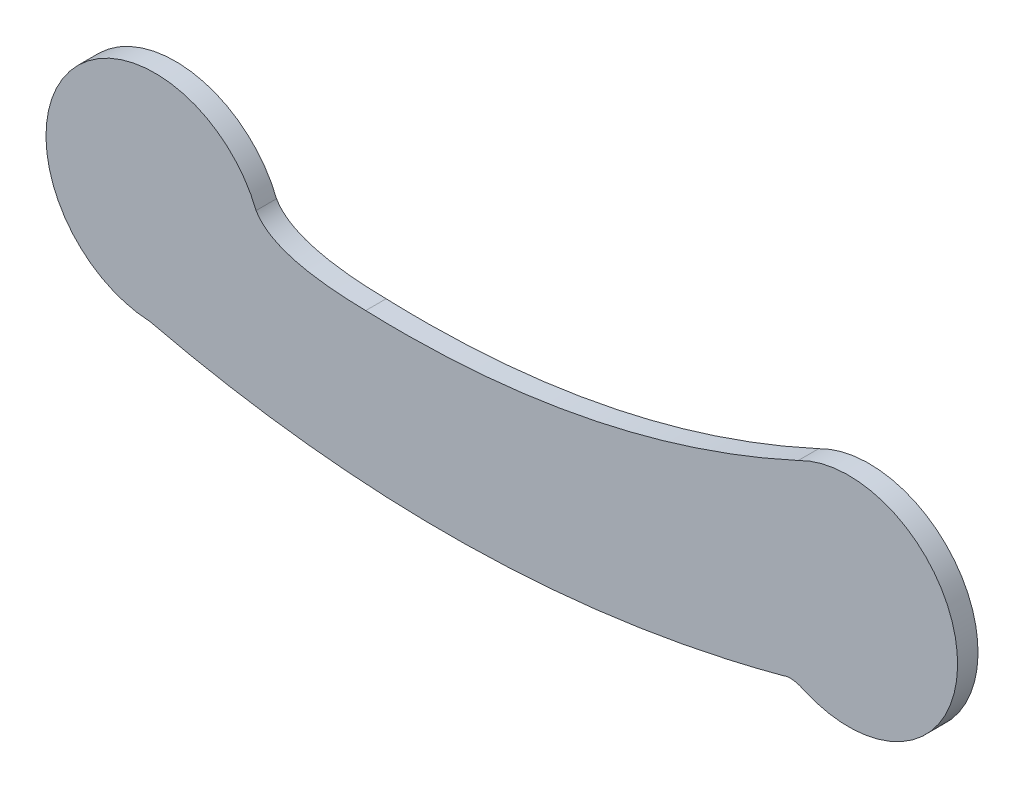
ISO-10303-21;
HEADER;
FILE_DESCRIPTION(('STEP AP214'),'2;1');
FILE_NAME('part.step','',(''),(''),'','','');
FILE_SCHEMA(('AUTOMOTIVE_DESIGN { 1 0 10303 214 1 1 1 1 }'));
ENDSEC;
DATA;
#1=APPLICATION_CONTEXT('core data for automotive mechanical design processes');
#2=APPLICATION_PROTOCOL_DEFINITION('international standard','automotive_design',2000,#1);
#3=PRODUCT_CONTEXT('',#1,'mechanical');
#4=PRODUCT('Part','Part','',(#3));
#5=PRODUCT_RELATED_PRODUCT_CATEGORY('part','',(#4));
#6=PRODUCT_DEFINITION_FORMATION('','',#4);
#7=PRODUCT_DEFINITION_CONTEXT('part definition',#1,'design');
#8=PRODUCT_DEFINITION('design','',#6,#7);
#9=PRODUCT_DEFINITION_SHAPE('','',#8);
#10=(LENGTH_UNIT() NAMED_UNIT(*) SI_UNIT(.MILLI.,.METRE.));
#11=(NAMED_UNIT(*) PLANE_ANGLE_UNIT() SI_UNIT($,.RADIAN.));
#12=(NAMED_UNIT(*) SI_UNIT($,.STERADIAN.) SOLID_ANGLE_UNIT());
#13=UNCERTAINTY_MEASURE_WITH_UNIT(LENGTH_MEASURE(1.E-05),#10,'distance_accuracy_value','');
#14=(GEOMETRIC_REPRESENTATION_CONTEXT(3) GLOBAL_UNCERTAINTY_ASSIGNED_CONTEXT((#13)) GLOBAL_UNIT_ASSIGNED_CONTEXT((#10,
#11,#12)) REPRESENTATION_CONTEXT('',''));
#15=CARTESIAN_POINT('',(0.,0.,0.));
#16=DIRECTION('',(0.,0.,1.));
#17=DIRECTION('',(1.,0.,0.));
#18=AXIS2_PLACEMENT_3D('',#15,#16,#17);
#19=CARTESIAN_POINT('',(75.3616109764842,-26.7469622202577,3.));
#20=DIRECTION('',(0.,0.,-1.));
#21=DIRECTION('',(-1.,0.,0.));
#22=AXIS2_PLACEMENT_3D('',#19,#20,#21);
#23=CYLINDRICAL_SURFACE('',#22,16.);
#24=CARTESIAN_POINT('',(75.3616109764842,-26.7469622202577,0.));
#25=DIRECTION('',(0.,0.,1.));
#26=DIRECTION('',(1.,0.,0.));
#27=AXIS2_PLACEMENT_3D('',#24,#25,#26);
#28=CIRCLE('',#27,16.);
#29=CARTESIAN_POINT('',(68.9358768880927,-41.3999462653347,0.));
#30=VERTEX_POINT('',#29);
#31=CARTESIAN_POINT('',(67.9572528132051,-12.5633279825216,0.));
#32=VERTEX_POINT('',#31);
#33=EDGE_CURVE('E176',#30,#32,#28,.T.);
#34=ORIENTED_EDGE('',*,*,#33,.T.);
#35=DIRECTION('',(0.,0.,-1.));
#36=VECTOR('',#35,1.);
#37=CARTESIAN_POINT('',(67.9572528132051,-12.5633279825216,3.));
#38=LINE('',#37,#36);
#39=CARTESIAN_POINT('',(67.9572528132051,-12.5633279825216,3.));
#40=VERTEX_POINT('',#39);
#41=EDGE_CURVE('E11',#40,#32,#38,.T.);
#42=ORIENTED_EDGE('',*,*,#41,.F.);
#43=CARTESIAN_POINT('',(75.3616109764842,-26.7469622202577,3.));
#44=DIRECTION('',(0.,0.,1.));
#45=DIRECTION('',(1.,0.,0.));
#46=AXIS2_PLACEMENT_3D('',#43,#44,#45);
#47=CIRCLE('',#46,16.);
#48=CARTESIAN_POINT('',(68.9358768880927,-41.3999462653347,3.));
#49=VERTEX_POINT('',#48);
#50=EDGE_CURVE('E149',#49,#40,#47,.T.);
#51=ORIENTED_EDGE('',*,*,#50,.F.);
#52=DIRECTION('',(0.,0.,-1.));
#53=VECTOR('',#52,1.);
#54=CARTESIAN_POINT('',(68.9358768880927,-41.3999462653347,3.));
#55=LINE('',#54,#53);
#56=EDGE_CURVE('E49',#49,#30,#55,.T.);
#57=ORIENTED_EDGE('',*,*,#56,.T.);
#58=EDGE_LOOP('',(#34,#42,#51,#57));
#59=FACE_BOUND('',#58,.T.);
#60=ADVANCED_FACE('F33',(#59),#23,.T.);
#61=CARTESIAN_POINT('',(67.9572528132051,-12.5633279825216,3.));
#62=CARTESIAN_POINT('',(65.4556098594679,-13.7138885821195,3.));
#63=CARTESIAN_POINT('',(60.3647877120199,-15.8829274038415,3.));
#64=CARTESIAN_POINT('',(52.6835599549813,-18.6412966622869,3.));
#65=CARTESIAN_POINT('',(44.8960667093759,-20.9332737764106,3.));
#66=CARTESIAN_POINT('',(37.015370971962,-22.7529524318276,3.));
#67=CARTESIAN_POINT('',(29.033864030959,-24.1030492663997,3.));
#68=CARTESIAN_POINT('',(20.9508494917721,-24.983508442152,3.));
#69=CARTESIAN_POINT('',(14.1235919102918,-25.3251410541217,3.));
#70=CARTESIAN_POINT('',(8.61459646137772,-25.3641244837702,3.));
#71=CARTESIAN_POINT('',(5.82883011956715,-25.3031223111578,3.));
#72=CARTESIAN_POINT('',(4.4406423971679,-25.2547251631972,3.));
#73=B_SPLINE_CURVE_WITH_KNOTS('',3,(#61,#62,#63,#64,#65,#66,#67,#68,#69,#70,#71,#72),
.UNSPECIFIED.,.F.,.F.,(4,1,1,1,1,1,1,1,1,4),(0.00341854294446011,0.11986733723747,
0.23631613153048,0.35276492582349,0.4692137201165,0.58566251440951,0.70211130870252,
0.81856010299553,0.876784500142035,0.93500889728854),.UNSPECIFIED.);
#74=DIRECTION('',(0.,0.,-1.));
#75=VECTOR('',#74,1.);
#76=SURFACE_OF_LINEAR_EXTRUSION('',#73,#75);
#77=CARTESIAN_POINT('',(67.9572528132051,-12.5633279825216,0.));
#78=CARTESIAN_POINT('',(65.4556098594679,-13.7138885821195,0.));
#79=CARTESIAN_POINT('',(60.3647877120199,-15.8829274038415,0.));
#80=CARTESIAN_POINT('',(52.6835599549813,-18.6412966622869,0.));
#81=CARTESIAN_POINT('',(44.8960667093759,-20.9332737764106,0.));
#82=CARTESIAN_POINT('',(37.015370971962,-22.7529524318276,0.));
#83=CARTESIAN_POINT('',(29.033864030959,-24.1030492663997,0.));
#84=CARTESIAN_POINT('',(20.9508494917721,-24.983508442152,0.));
#85=CARTESIAN_POINT('',(14.1235919102918,-25.3251410541217,0.));
#86=CARTESIAN_POINT('',(8.61459646137772,-25.3641244837702,0.));
#87=CARTESIAN_POINT('',(5.82883011956715,-25.3031223111578,0.));
#88=CARTESIAN_POINT('',(4.4406423971679,-25.2547251631972,0.));
#89=B_SPLINE_CURVE_WITH_KNOTS('',3,(#77,#78,#79,#80,#81,#82,#83,#84,#85,#86,#87,#88),
.UNSPECIFIED.,.F.,.F.,(4,1,1,1,1,1,1,1,1,4),(0.00341854294446011,0.11986733723747,
0.23631613153048,0.35276492582349,0.4692137201165,0.58566251440951,0.70211130870252,
0.81856010299553,0.876784500142035,0.93500889728854),.UNSPECIFIED.);
#90=CARTESIAN_POINT('',(4.44064239716792,-25.2547251631972,0.));
#91=VERTEX_POINT('',#90);
#92=EDGE_CURVE('E175',#32,#91,#89,.T.);
#93=ORIENTED_EDGE('',*,*,#92,.T.);
#94=DIRECTION('',(0.,0.,-1.));
#95=VECTOR('',#94,1.);
#96=CARTESIAN_POINT('',(4.44064239716792,-25.2547251631972,3.));
#97=LINE('',#96,#95);
#98=CARTESIAN_POINT('',(4.44064239716792,-25.2547251631972,3.));
#99=VERTEX_POINT('',#98);
#100=EDGE_CURVE('E41',#99,#91,#97,.T.);
#101=ORIENTED_EDGE('',*,*,#100,.F.);
#102=EDGE_CURVE('E82',#40,#99,#73,.T.);
#103=ORIENTED_EDGE('',*,*,#102,.F.);
#104=ORIENTED_EDGE('',*,*,#41,.T.);
#105=EDGE_LOOP('',(#93,#101,#103,#104));
#106=FACE_BOUND('',#105,.T.);
#107=ADVANCED_FACE('F136',(#106),#76,.F.);
#108=CARTESIAN_POINT('',(-11.6582778871827,-20.5832062997033,3.));
#109=CARTESIAN_POINT('',(-9.06568830226586,-25.0600463083087,3.));
#110=CARTESIAN_POINT('',(4.44064239716792,-25.2547251631972,3.));
#111=B_SPLINE_CURVE_WITH_KNOTS('',2,(#108,#109,#110),.UNSPECIFIED.,.F.,.F.,(3,3),(0.,1.),.UNSPECIFIED.);
#112=DIRECTION('',(0.,0.,-1.));
#113=VECTOR('',#112,1.);
#114=SURFACE_OF_LINEAR_EXTRUSION('',#111,#113);
#115=CARTESIAN_POINT('',(-11.6582778871827,-20.5832062997033,0.));
#116=CARTESIAN_POINT('',(-9.06568830226586,-25.0600463083087,0.));
#117=CARTESIAN_POINT('',(4.44064239716792,-25.2547251631972,0.));
#118=B_SPLINE_CURVE_WITH_KNOTS('',2,(#115,#116,#117),.UNSPECIFIED.,.F.,.F.,(3,3),(0.,1.),.UNSPECIFIED.);
#119=CARTESIAN_POINT('',(-11.6582778871827,-20.5832062997033,0.));
#120=VERTEX_POINT('',#119);
#121=EDGE_CURVE('E174',#120,#91,#118,.T.);
#122=ORIENTED_EDGE('',*,*,#121,.F.);
#123=DIRECTION('',(0.,0.,-1.));
#124=VECTOR('',#123,1.);
#125=CARTESIAN_POINT('',(-11.6582778871827,-20.5832062997033,3.));
#126=LINE('',#125,#124);
#127=CARTESIAN_POINT('',(-11.6582778871827,-20.5832062997033,3.));
#128=VERTEX_POINT('',#127);
#129=EDGE_CURVE('E109',#128,#120,#126,.T.);
#130=ORIENTED_EDGE('',*,*,#129,.F.);
#131=EDGE_CURVE('E99',#128,#99,#111,.T.);
#132=ORIENTED_EDGE('',*,*,#131,.T.);
#133=ORIENTED_EDGE('',*,*,#100,.T.);
#134=EDGE_LOOP('',(#122,#130,#132,#133));
#135=FACE_BOUND('',#134,.T.);
#136=ADVANCED_FACE('F134',(#135),#114,.T.);
#137=CARTESIAN_POINT('',(-26.5181075061683,-26.5149399160011,3.));
#138=DIRECTION('',(0.,0.,-1.));
#139=DIRECTION('',(-1.,0.,0.));
#140=AXIS2_PLACEMENT_3D('',#137,#138,#139);
#141=CYLINDRICAL_SURFACE('',#140,16.);
#142=CARTESIAN_POINT('',(-26.5181075061683,-26.5149399160011,0.));
#143=DIRECTION('',(0.,0.,1.));
#144=DIRECTION('',(1.,0.,0.));
#145=AXIS2_PLACEMENT_3D('',#142,#143,#144);
#146=CIRCLE('',#145,16.);
#147=CARTESIAN_POINT('',(-27.2644197044283,-42.4975247539655,0.));
#148=VERTEX_POINT('',#147);
#149=EDGE_CURVE('E106',#120,#148,#146,.T.);
#150=ORIENTED_EDGE('',*,*,#149,.T.);
#151=DIRECTION('',(0.,0.,-1.));
#152=VECTOR('',#151,1.);
#153=CARTESIAN_POINT('',(-27.2644197044283,-42.4975247539655,3.));
#154=LINE('',#153,#152);
#155=CARTESIAN_POINT('',(-27.2644197044283,-42.4975247539655,3.));
#156=VERTEX_POINT('',#155);
#157=EDGE_CURVE('E103',#156,#148,#154,.T.);
#158=ORIENTED_EDGE('',*,*,#157,.F.);
#159=CARTESIAN_POINT('',(-26.5181075061683,-26.5149399160011,3.));
#160=DIRECTION('',(0.,0.,1.));
#161=DIRECTION('',(1.,0.,0.));
#162=AXIS2_PLACEMENT_3D('',#159,#160,#161);
#163=CIRCLE('',#162,16.);
#164=EDGE_CURVE('E92',#128,#156,#163,.T.);
#165=ORIENTED_EDGE('',*,*,#164,.F.);
#166=ORIENTED_EDGE('',*,*,#129,.T.);
#167=EDGE_LOOP('',(#150,#158,#165,#166));
#168=FACE_BOUND('',#167,.T.);
#169=ADVANCED_FACE('F104',(#168),#141,.T.);
#170=CARTESIAN_POINT('',(-27.2644197044276,-42.4975247539655,3.));
#171=CARTESIAN_POINT('',(-25.3344602529767,-42.9557682014861,3.));
#172=CARTESIAN_POINT('',(-21.4523206415567,-43.8161247367878,3.));
#173=CARTESIAN_POINT('',(-13.705385842308,-45.286858173721,3.));
#174=CARTESIAN_POINT('',(-4.00642196389961,-46.6675335741339,3.));
#175=CARTESIAN_POINT('',(7.63826965763481,-47.5868316562072,3.));
#176=CARTESIAN_POINT('',(19.2892418436512,-47.768762721637,3.));
#177=CARTESIAN_POINT('',(30.9419259546077,-47.2128244109878,3.));
#178=CARTESIAN_POINT('',(42.5916012864147,-45.9200005036387,3.));
#179=CARTESIAN_POINT('',(52.2981628156652,-44.2285225970587,3.));
#180=CARTESIAN_POINT('',(60.052175741786,-42.5101462880769,3.));
#181=CARTESIAN_POINT('',(63.9402836252542,-41.5253536195929,3.));
#182=CARTESIAN_POINT('',(65.8717394752302,-41.0057257796487,3.));
#183=B_SPLINE_CURVE_WITH_KNOTS('',3,(#170,#171,#172,#173,#174,#175,#176,#177,#178,#179,#180,
#181,#182),.UNSPECIFIED.,.F.,.F.,(4,1,1,1,1,1,1,1,1,1,4),(0.0041894223970447,0.0664275834972294,
0.128665744597414,0.253142066797784,0.377618388998153,0.502094711198522,0.626571033398892,
0.751047355599261,0.875523677799631,0.937761838899815,1.),.UNSPECIFIED.);
#184=DIRECTION('',(0.,0.,-1.));
#185=VECTOR('',#184,1.);
#186=SURFACE_OF_LINEAR_EXTRUSION('',#183,#185);
#187=CARTESIAN_POINT('',(-27.2644197044276,-42.4975247539655,0.));
#188=CARTESIAN_POINT('',(-25.3344602529767,-42.9557682014861,0.));
#189=CARTESIAN_POINT('',(-21.4523206415567,-43.8161247367878,0.));
#190=CARTESIAN_POINT('',(-13.705385842308,-45.286858173721,0.));
#191=CARTESIAN_POINT('',(-4.00642196389961,-46.6675335741339,0.));
#192=CARTESIAN_POINT('',(7.63826965763481,-47.5868316562072,0.));
#193=CARTESIAN_POINT('',(19.2892418436512,-47.768762721637,0.));
#194=CARTESIAN_POINT('',(30.9419259546077,-47.2128244109878,0.));
#195=CARTESIAN_POINT('',(42.5916012864147,-45.9200005036387,0.));
#196=CARTESIAN_POINT('',(52.2981628156652,-44.2285225970587,0.));
#197=CARTESIAN_POINT('',(60.052175741786,-42.5101462880769,0.));
#198=CARTESIAN_POINT('',(63.9402836252542,-41.5253536195929,0.));
#199=CARTESIAN_POINT('',(65.8717394752302,-41.0057257796487,0.));
#200=B_SPLINE_CURVE_WITH_KNOTS('',3,(#187,#188,#189,#190,#191,#192,#193,#194,#195,#196,#197,
#198,#199),.UNSPECIFIED.,.F.,.F.,(4,1,1,1,1,1,1,1,1,1,4),(0.0041894223970447,0.0664275834972294,
0.128665744597414,0.253142066797784,0.377618388998153,0.502094711198522,0.626571033398892,
0.751047355599261,0.875523677799631,0.937761838899815,1.),.UNSPECIFIED.);
#201=CARTESIAN_POINT('',(65.8717394752302,-41.0057257796487,0.));
#202=VERTEX_POINT('',#201);
#203=EDGE_CURVE('E156',#148,#202,#200,.T.);
#204=ORIENTED_EDGE('',*,*,#203,.T.);
#205=DIRECTION('',(0.,0.,-1.));
#206=VECTOR('',#205,1.);
#207=CARTESIAN_POINT('',(65.8717394752302,-41.0057257796487,3.));
#208=LINE('',#207,#206);
#209=CARTESIAN_POINT('',(65.8717394752302,-41.0057257796487,3.));
#210=VERTEX_POINT('',#209);
#211=EDGE_CURVE('E70',#210,#202,#208,.T.);
#212=ORIENTED_EDGE('',*,*,#211,.F.);
#213=EDGE_CURVE('E97',#156,#210,#183,.T.);
#214=ORIENTED_EDGE('',*,*,#213,.F.);
#215=ORIENTED_EDGE('',*,*,#157,.T.);
#216=EDGE_LOOP('',(#204,#212,#214,#215));
#217=FACE_BOUND('',#216,.T.);
#218=ADVANCED_FACE('F111',(#217),#186,.F.);
#219=CARTESIAN_POINT('',(68.9358768880927,-41.3999462653347,3.));
#220=CARTESIAN_POINT('',(67.0567787838708,-40.5292801779469,3.));
#221=CARTESIAN_POINT('',(65.8717394752302,-41.0057257796487,3.));
#222=B_SPLINE_CURVE_WITH_KNOTS('',2,(#219,#220,#221),.UNSPECIFIED.,.F.,.F.,(3,3),(0.,1.),.UNSPECIFIED.);
#223=DIRECTION('',(0.,0.,-1.));
#224=VECTOR('',#223,1.);
#225=SURFACE_OF_LINEAR_EXTRUSION('',#222,#224);
#226=CARTESIAN_POINT('',(68.9358768880927,-41.3999462653347,0.));
#227=CARTESIAN_POINT('',(67.0567787838708,-40.5292801779469,0.));
#228=CARTESIAN_POINT('',(65.8717394752302,-41.0057257796487,0.));
#229=B_SPLINE_CURVE_WITH_KNOTS('',2,(#226,#227,#228),.UNSPECIFIED.,.F.,.F.,(3,3),(0.,1.),.UNSPECIFIED.);
#230=EDGE_CURVE('E153',#30,#202,#229,.T.);
#231=ORIENTED_EDGE('',*,*,#230,.F.);
#232=ORIENTED_EDGE('',*,*,#56,.F.);
#233=EDGE_CURVE('E112',#49,#210,#222,.T.);
#234=ORIENTED_EDGE('',*,*,#233,.T.);
#235=ORIENTED_EDGE('',*,*,#211,.T.);
#236=EDGE_LOOP('',(#231,#232,#234,#235));
#237=FACE_BOUND('',#236,.T.);
#238=ADVANCED_FACE('F130',(#237),#225,.T.);
#239=CARTESIAN_POINT('',(0.,0.,3.));
#240=DIRECTION('',(0.,0.,1.));
#241=DIRECTION('',(1.,0.,0.));
#242=AXIS2_PLACEMENT_3D('',#239,#240,#241);
#243=PLANE('',#242);
#244=ORIENTED_EDGE('',*,*,#50,.T.);
#245=ORIENTED_EDGE('',*,*,#102,.T.);
#246=ORIENTED_EDGE('',*,*,#131,.F.);
#247=ORIENTED_EDGE('',*,*,#164,.T.);
#248=ORIENTED_EDGE('',*,*,#213,.T.);
#249=ORIENTED_EDGE('',*,*,#233,.F.);
#250=EDGE_LOOP('',(#244,#245,#246,#247,#248,#249));
#251=FACE_BOUND('',#250,.T.);
#252=ADVANCED_FACE('F94',(#251),#243,.T.);
#253=CARTESIAN_POINT('',(0.,0.,0.));
#254=DIRECTION('',(0.,0.,1.));
#255=DIRECTION('',(1.,0.,0.));
#256=AXIS2_PLACEMENT_3D('',#253,#254,#255);
#257=PLANE('',#256);
#258=ORIENTED_EDGE('',*,*,#33,.F.);
#259=ORIENTED_EDGE('',*,*,#230,.T.);
#260=ORIENTED_EDGE('',*,*,#203,.F.);
#261=ORIENTED_EDGE('',*,*,#149,.F.);
#262=ORIENTED_EDGE('',*,*,#121,.T.);
#263=ORIENTED_EDGE('',*,*,#92,.F.);
#264=EDGE_LOOP('',(#258,#259,#260,#261,#262,#263));
#265=FACE_BOUND('',#264,.T.);
#266=ADVANCED_FACE('F178',(#265),#257,.F.);
#267=CLOSED_SHELL('',(#60,#107,#136,#169,#218,#238,#252,#266));
#268=MANIFOLD_SOLID_BREP('B2',#267);
#269=ADVANCED_BREP_SHAPE_REPRESENTATION('',(#18,#268),#14);
#270=SHAPE_DEFINITION_REPRESENTATION(#9,#269);
ENDSEC;
END-ISO-10303-21;
